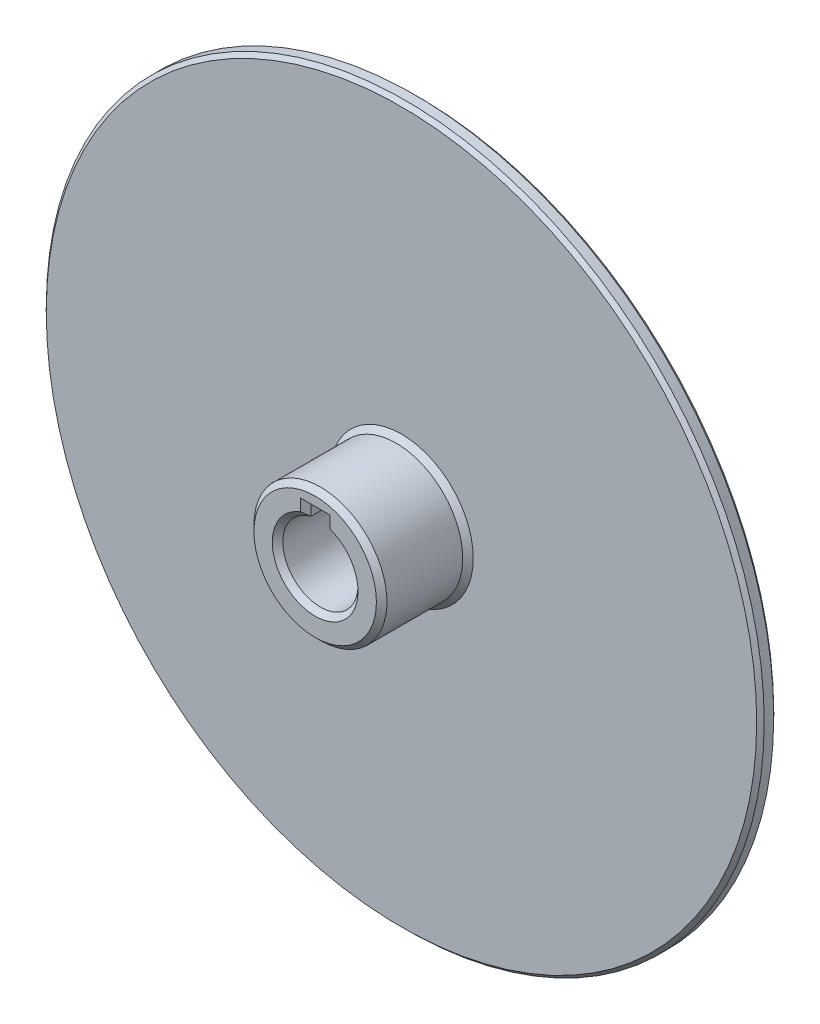
ISO-10303-21;
HEADER;
FILE_DESCRIPTION(('STEP AP214'),'2;1');
FILE_NAME('part.step','',(''),(''),'','','');
FILE_SCHEMA(('AUTOMOTIVE_DESIGN { 1 0 10303 214 1 1 1 1 }'));
ENDSEC;
DATA;
#1=APPLICATION_CONTEXT('core data for automotive mechanical design processes');
#2=APPLICATION_PROTOCOL_DEFINITION('international standard','automotive_design',2000,#1);
#3=PRODUCT_CONTEXT('',#1,'mechanical');
#4=PRODUCT('Part','Part','',(#3));
#5=PRODUCT_RELATED_PRODUCT_CATEGORY('part','',(#4));
#6=PRODUCT_DEFINITION_FORMATION('','',#4);
#7=PRODUCT_DEFINITION_CONTEXT('part definition',#1,'design');
#8=PRODUCT_DEFINITION('design','',#6,#7);
#9=PRODUCT_DEFINITION_SHAPE('','',#8);
#10=(LENGTH_UNIT() NAMED_UNIT(*) SI_UNIT(.MILLI.,.METRE.));
#11=(NAMED_UNIT(*) PLANE_ANGLE_UNIT() SI_UNIT($,.RADIAN.));
#12=(NAMED_UNIT(*) SI_UNIT($,.STERADIAN.) SOLID_ANGLE_UNIT());
#13=UNCERTAINTY_MEASURE_WITH_UNIT(LENGTH_MEASURE(1.E-05),#10,'distance_accuracy_value','');
#14=(GEOMETRIC_REPRESENTATION_CONTEXT(3) GLOBAL_UNCERTAINTY_ASSIGNED_CONTEXT((#13)) GLOBAL_UNIT_ASSIGNED_CONTEXT((#10,
#11,#12)) REPRESENTATION_CONTEXT('',''));
#15=CARTESIAN_POINT('',(0.,0.,0.));
#16=DIRECTION('',(0.,0.,1.));
#17=DIRECTION('',(1.,0.,0.));
#18=AXIS2_PLACEMENT_3D('',#15,#16,#17);
#19=CARTESIAN_POINT('',(0.,0.,5.7658));
#20=DIRECTION('',(0.,0.,-1.));
#21=DIRECTION('',(-1.,0.,0.));
#22=AXIS2_PLACEMENT_3D('',#19,#20,#21);
#23=CYLINDRICAL_SURFACE('',#22,121.3314985735);
#24=CARTESIAN_POINT('',(0.,0.,1.27000000000012));
#25=DIRECTION('',(0.,0.,1.));
#26=DIRECTION('',(1.,0.,0.));
#27=AXIS2_PLACEMENT_3D('',#24,#25,#26);
#28=CIRCLE('',#27,121.3314985735);
#29=CARTESIAN_POINT('',(-121.3314985735,0.,1.27000000000012));
#30=VERTEX_POINT('',#29);
#31=EDGE_CURVE('E349',#30,#30,#28,.T.);
#32=CARTESIAN_POINT('',(0.,0.,4.49580000000024));
#33=DIRECTION('',(0.,0.,1.));
#34=DIRECTION('',(1.,0.,0.));
#35=AXIS2_PLACEMENT_3D('',#32,#33,#34);
#36=CIRCLE('',#35,121.3314985735);
#37=CARTESIAN_POINT('',(-121.3314985735,0.,4.49580000000024));
#38=VERTEX_POINT('',#37);
#39=EDGE_CURVE('E339',#38,#38,#36,.F.);
#40=CARTESIAN_POINT('',(-121.3314985735,0.,1.27000000000012));
#41=CARTESIAN_POINT('',(-121.3314985735,0.,1.30360208333345));
#42=CARTESIAN_POINT('',(-121.3314985735,0.,1.33720416666679));
#43=CARTESIAN_POINT('',(-121.3314985735,0.,1.40440833333346));
#44=CARTESIAN_POINT('',(-121.3314985735,0.,1.43801041666679));
#45=CARTESIAN_POINT('',(-121.3314985735,0.,1.50521458333346));
#46=CARTESIAN_POINT('',(-121.3314985735,0.,1.53881666666679));
#47=CARTESIAN_POINT('',(-121.3314985735,0.,1.60602083333346));
#48=CARTESIAN_POINT('',(-121.3314985735,0.,1.6396229166668));
#49=CARTESIAN_POINT('',(-121.3314985735,0.,1.70682708333347));
#50=CARTESIAN_POINT('',(-121.3314985735,0.,1.7404291666668));
#51=CARTESIAN_POINT('',(-121.3314985735,0.,1.80763333333347));
#52=CARTESIAN_POINT('',(-121.3314985735,0.,1.84123541666681));
#53=CARTESIAN_POINT('',(-121.3314985735,0.,1.90843958333348));
#54=CARTESIAN_POINT('',(-121.3314985735,0.,1.94204166666681));
#55=CARTESIAN_POINT('',(-121.3314985735,0.,2.00924583333348));
#56=CARTESIAN_POINT('',(-121.3314985735,0.,2.04284791666681));
#57=CARTESIAN_POINT('',(-121.3314985735,0.,2.11005208333348));
#58=CARTESIAN_POINT('',(-121.3314985735,0.,2.14365416666682));
#59=CARTESIAN_POINT('',(-121.3314985735,0.,2.21085833333349));
#60=CARTESIAN_POINT('',(-121.3314985735,0.,2.24446041666682));
#61=CARTESIAN_POINT('',(-121.3314985735,0.,2.31166458333349));
#62=CARTESIAN_POINT('',(-121.3314985735,0.,2.34526666666683));
#63=CARTESIAN_POINT('',(-121.3314985735,0.,2.41247083333349));
#64=CARTESIAN_POINT('',(-121.3314985735,0.,2.44607291666683));
#65=CARTESIAN_POINT('',(-121.3314985735,0.,2.5132770833335));
#66=CARTESIAN_POINT('',(-121.3314985735,0.,2.54687916666683));
#67=CARTESIAN_POINT('',(-121.3314985735,0.,2.6140833333335));
#68=CARTESIAN_POINT('',(-121.3314985735,0.,2.64768541666684));
#69=CARTESIAN_POINT('',(-121.3314985735,0.,2.71488958333351));
#70=CARTESIAN_POINT('',(-121.3314985735,0.,2.74849166666684));
#71=CARTESIAN_POINT('',(-121.3314985735,0.,2.81569583333351));
#72=CARTESIAN_POINT('',(-121.3314985735,0.,2.84929791666684));
#73=CARTESIAN_POINT('',(-121.3314985735,0.,2.91650208333351));
#74=CARTESIAN_POINT('',(-121.3314985735,0.,2.95010416666685));
#75=CARTESIAN_POINT('',(-121.3314985735,0.,3.01730833333352));
#76=CARTESIAN_POINT('',(-121.3314985735,0.,3.05091041666685));
#77=CARTESIAN_POINT('',(-121.3314985735,0.,3.11811458333352));
#78=CARTESIAN_POINT('',(-121.3314985735,0.,3.15171666666686));
#79=CARTESIAN_POINT('',(-121.3314985735,0.,3.21892083333353));
#80=CARTESIAN_POINT('',(-121.3314985735,0.,3.25252291666686));
#81=CARTESIAN_POINT('',(-121.3314985735,0.,3.31972708333353));
#82=CARTESIAN_POINT('',(-121.3314985735,0.,3.35332916666686));
#83=CARTESIAN_POINT('',(-121.3314985735,0.,3.42053333333353));
#84=CARTESIAN_POINT('',(-121.3314985735,0.,3.45413541666687));
#85=CARTESIAN_POINT('',(-121.3314985735,0.,3.52133958333354));
#86=CARTESIAN_POINT('',(-121.3314985735,0.,3.55494166666687));
#87=CARTESIAN_POINT('',(-121.3314985735,0.,3.62214583333354));
#88=CARTESIAN_POINT('',(-121.3314985735,0.,3.65574791666688));
#89=CARTESIAN_POINT('',(-121.3314985735,0.,3.72295208333355));
#90=CARTESIAN_POINT('',(-121.3314985735,0.,3.75655416666688));
#91=CARTESIAN_POINT('',(-121.3314985735,0.,3.82375833333355));
#92=CARTESIAN_POINT('',(-121.3314985735,0.,3.85736041666688));
#93=CARTESIAN_POINT('',(-121.3314985735,0.,3.92456458333355));
#94=CARTESIAN_POINT('',(-121.3314985735,0.,3.95816666666689));
#95=CARTESIAN_POINT('',(-121.3314985735,0.,4.02537083333356));
#96=CARTESIAN_POINT('',(-121.3314985735,0.,4.05897291666689));
#97=CARTESIAN_POINT('',(-121.3314985735,0.,4.12617708333356));
#98=CARTESIAN_POINT('',(-121.3314985735,0.,4.1597791666669));
#99=CARTESIAN_POINT('',(-121.3314985735,0.,4.22698333333356));
#100=CARTESIAN_POINT('',(-121.3314985735,0.,4.2605854166669));
#101=CARTESIAN_POINT('',(-121.3314985735,0.,4.32778958333357));
#102=CARTESIAN_POINT('',(-121.3314985735,0.,4.3613916666669));
#103=CARTESIAN_POINT('',(-121.3314985735,0.,4.42859583333357));
#104=CARTESIAN_POINT('',(-121.3314985735,0.,4.46219791666691));
#105=CARTESIAN_POINT('',(-121.3314985735,0.,4.49580000000024));
#106=B_SPLINE_CURVE_WITH_KNOTS('',3,(#40,#41,#42,#43,#44,#45,#46,#47,#48,#49,#50,#51,#52,#53,
#54,#55,#56,#57,#58,#59,#60,#61,#62,#63,#64,#65,#66,#67,#68,#69,#70,#71,#72,#73,#74,#75,#76,#77,
#78,#79,#80,#81,#82,#83,#84,#85,#86,#87,#88,#89,#90,#91,#92,#93,#94,#95,#96,#97,#98,#99,#100,
#101,#102,#103,#104,#105),.UNSPECIFIED.,.F.,.F.,(4,2,2,2,2,2,2,2,2,2,2,2,2,2,2,2,2,2,2,2,2,2,2,
2,2,2,2,2,2,2,2,2,4),(0.,0.100806250000003,0.201612500000008,0.302418750000011,
0.403225000000016,0.504031250000019,0.604837500000023,0.705643750000027,0.806450000000031,
0.907256250000035,1.00806250000004,1.10886875000004,1.20967500000005,1.31048125000005,
1.41128750000005,1.51209375000006,1.61290000000006,1.71370625000007,1.81451250000007,
1.91531875000007,2.01612500000008,2.11693125000008,2.21773750000009,2.31854375000009,
2.41935000000009,2.5201562500001,2.6209625000001,2.7217687500001,2.82257500000011,
2.92338125000011,3.02418750000012,3.12499375000012,3.22580000000012),.UNSPECIFIED.);
#107=EDGE_CURVE('BSEAM49',#30,#38,#106,.T.);
#108=ORIENTED_EDGE('',*,*,#31,.T.);
#109=ORIENTED_EDGE('',*,*,#39,.T.);
#110=ORIENTED_EDGE('',*,*,#107,.T.);
#111=ORIENTED_EDGE('',*,*,#107,.F.);
#112=EDGE_LOOP('',(#108,#110,#109,#111));
#113=FACE_BOUND('',#112,.T.);
#114=ADVANCED_FACE('F49',(#113),#23,.T.);
#115=CARTESIAN_POINT('',(0.,0.,5.7658));
#116=DIRECTION('',(0.,0.,1.));
#117=DIRECTION('',(1.,0.,0.));
#118=AXIS2_PLACEMENT_3D('',#115,#116,#117);
#119=PLANE('',#118);
#120=CARTESIAN_POINT('',(0.,0.,5.7658));
#121=DIRECTION('',(0.,0.,1.));
#122=DIRECTION('',(1.,0.,0.));
#123=AXIS2_PLACEMENT_3D('',#120,#121,#122);
#124=CIRCLE('',#123,24.2570000000002);
#125=CARTESIAN_POINT('',(24.2570000000002,0.,5.7658));
#126=VERTEX_POINT('',#125);
#127=EDGE_CURVE('E11',#126,#126,#124,.F.);
#128=ORIENTED_EDGE('',*,*,#127,.T.);
#129=EDGE_LOOP('',(#128));
#130=FACE_BOUND('',#129,.T.);
#131=CARTESIAN_POINT('',(0.,0.,5.7658));
#132=DIRECTION('',(0.,0.,1.));
#133=DIRECTION('',(1.,0.,0.));
#134=AXIS2_PLACEMENT_3D('',#131,#132,#133);
#135=CIRCLE('',#134,120.0614985735);
#136=CARTESIAN_POINT('',(120.0614985735,0.,5.7658));
#137=VERTEX_POINT('',#136);
#138=EDGE_CURVE('E162',#137,#137,#135,.T.);
#139=ORIENTED_EDGE('',*,*,#138,.T.);
#140=EDGE_LOOP('',(#139));
#141=FACE_BOUND('',#140,.T.);
#142=ADVANCED_FACE('F311',(#130,#141),#119,.T.);
#143=CARTESIAN_POINT('',(0.,0.,0.));
#144=DIRECTION('',(0.,0.,1.));
#145=DIRECTION('',(1.,0.,0.));
#146=AXIS2_PLACEMENT_3D('',#143,#144,#145);
#147=PLANE('',#146);
#148=CARTESIAN_POINT('',(0.,0.,0.));
#149=DIRECTION('',(0.,0.,1.));
#150=DIRECTION('',(1.,0.,0.));
#151=AXIS2_PLACEMENT_3D('',#148,#149,#150);
#152=CIRCLE('',#151,14.478);
#153=CARTESIAN_POINT('',(-4.953,13.6044211563741,0.));
#154=VERTEX_POINT('',#153);
#155=CARTESIAN_POINT('',(4.953,13.6044211563741,0.));
#156=VERTEX_POINT('',#155);
#157=EDGE_CURVE('E167',#154,#156,#152,.T.);
#158=ORIENTED_EDGE('',*,*,#157,.T.);
#159=DIRECTION('',(0.,1.,0.));
#160=VECTOR('',#159,1.);
#161=CARTESIAN_POINT('',(4.953,0.,0.));
#162=LINE('',#161,#160);
#163=CARTESIAN_POINT('',(4.953,17.653,0.));
#164=VERTEX_POINT('',#163);
#165=EDGE_CURVE('E145',#156,#164,#162,.T.);
#166=ORIENTED_EDGE('',*,*,#165,.T.);
#167=DIRECTION('',(-1.,0.,0.));
#168=VECTOR('',#167,1.);
#169=CARTESIAN_POINT('',(0.,17.653,0.));
#170=LINE('',#169,#168);
#171=CARTESIAN_POINT('',(-4.953,17.653,0.));
#172=VERTEX_POINT('',#171);
#173=EDGE_CURVE('E154',#164,#172,#170,.T.);
#174=ORIENTED_EDGE('',*,*,#173,.T.);
#175=DIRECTION('',(0.,-1.,0.));
#176=VECTOR('',#175,1.);
#177=CARTESIAN_POINT('',(-4.953,0.,0.));
#178=LINE('',#177,#176);
#179=EDGE_CURVE('E161',#172,#154,#178,.T.);
#180=ORIENTED_EDGE('',*,*,#179,.T.);
#181=EDGE_LOOP('',(#158,#166,#174,#180));
#182=FACE_BOUND('',#181,.T.);
#183=CARTESIAN_POINT('',(0.,0.,0.));
#184=DIRECTION('',(0.,0.,1.));
#185=DIRECTION('',(1.,0.,0.));
#186=AXIS2_PLACEMENT_3D('',#183,#184,#185);
#187=CIRCLE('',#186,120.0614985735);
#188=CARTESIAN_POINT('',(120.0614985735,0.,0.));
#189=VERTEX_POINT('',#188);
#190=EDGE_CURVE('E344',#189,#189,#187,.F.);
#191=ORIENTED_EDGE('',*,*,#190,.T.);
#192=EDGE_LOOP('',(#191));
#193=FACE_BOUND('',#192,.T.);
#194=ADVANCED_FACE('F164',(#182,#193),#147,.F.);
#195=CARTESIAN_POINT('',(0.,0.,34.940748));
#196=DIRECTION('',(0.,0.,-1.));
#197=DIRECTION('',(-1.,0.,0.));
#198=AXIS2_PLACEMENT_3D('',#195,#196,#197);
#199=CYLINDRICAL_SURFACE('',#198,22.479);
#200=CARTESIAN_POINT('',(0.,0.,7.54380000000021));
#201=DIRECTION('',(0.,0.,1.));
#202=DIRECTION('',(1.,0.,0.));
#203=AXIS2_PLACEMENT_3D('',#200,#201,#202);
#204=CIRCLE('',#203,22.479);
#205=CARTESIAN_POINT('',(-22.479,0.,7.54380000000021));
#206=VERTEX_POINT('',#205);
#207=EDGE_CURVE('E66',#206,#206,#204,.T.);
#208=CARTESIAN_POINT('',(0.,0.,33.1627480000002));
#209=DIRECTION('',(0.,0.,1.));
#210=DIRECTION('',(1.,0.,0.));
#211=AXIS2_PLACEMENT_3D('',#208,#209,#210);
#212=CIRCLE('',#211,22.479);
#213=CARTESIAN_POINT('',(-22.479,0.,33.1627480000002));
#214=VERTEX_POINT('',#213);
#215=EDGE_CURVE('E214',#214,#214,#212,.F.);
#216=CARTESIAN_POINT('',(-22.479,0.,7.54380000000021));
#217=CARTESIAN_POINT('',(-22.479,0.,7.81066404166687));
#218=CARTESIAN_POINT('',(-22.479,0.,8.07752808333354));
#219=CARTESIAN_POINT('',(-22.479,0.,8.61125616666687));
#220=CARTESIAN_POINT('',(-22.479,0.,8.87812020833354));
#221=CARTESIAN_POINT('',(-22.479,0.,9.41184829166687));
#222=CARTESIAN_POINT('',(-22.479,0.,9.67871233333354));
#223=CARTESIAN_POINT('',(-22.479,0.,10.2124404166669));
#224=CARTESIAN_POINT('',(-22.479,0.,10.4793044583335));
#225=CARTESIAN_POINT('',(-22.479,0.,11.0130325416669));
#226=CARTESIAN_POINT('',(-22.479,0.,11.2798965833335));
#227=CARTESIAN_POINT('',(-22.479,0.,11.8136246666669));
#228=CARTESIAN_POINT('',(-22.479,0.,12.0804887083335));
#229=CARTESIAN_POINT('',(-22.479,0.,12.6142167916669));
#230=CARTESIAN_POINT('',(-22.479,0.,12.8810808333335));
#231=CARTESIAN_POINT('',(-22.479,0.,13.4148089166669));
#232=CARTESIAN_POINT('',(-22.479,0.,13.6816729583335));
#233=CARTESIAN_POINT('',(-22.479,0.,14.2154010416669));
#234=CARTESIAN_POINT('',(-22.479,0.,14.4822650833335));
#235=CARTESIAN_POINT('',(-22.479,0.,15.0159931666669));
#236=CARTESIAN_POINT('',(-22.479,0.,15.2828572083335));
#237=CARTESIAN_POINT('',(-22.479,0.,15.8165852916669));
#238=CARTESIAN_POINT('',(-22.479,0.,16.0834493333335));
#239=CARTESIAN_POINT('',(-22.479,0.,16.6171774166669));
#240=CARTESIAN_POINT('',(-22.479,0.,16.8840414583335));
#241=CARTESIAN_POINT('',(-22.479,0.,17.4177695416669));
#242=CARTESIAN_POINT('',(-22.479,0.,17.6846335833335));
#243=CARTESIAN_POINT('',(-22.479,0.,18.2183616666669));
#244=CARTESIAN_POINT('',(-22.479,0.,18.4852257083335));
#245=CARTESIAN_POINT('',(-22.479,0.,19.0189537916669));
#246=CARTESIAN_POINT('',(-22.479,0.,19.2858178333335));
#247=CARTESIAN_POINT('',(-22.479,0.,19.8195459166669));
#248=CARTESIAN_POINT('',(-22.479,0.,20.0864099583335));
#249=CARTESIAN_POINT('',(-22.479,0.,20.6201380416669));
#250=CARTESIAN_POINT('',(-22.479,0.,20.8870020833335));
#251=CARTESIAN_POINT('',(-22.479,0.,21.4207301666669));
#252=CARTESIAN_POINT('',(-22.479,0.,21.6875942083335));
#253=CARTESIAN_POINT('',(-22.479,0.,22.2213222916669));
#254=CARTESIAN_POINT('',(-22.479,0.,22.4881863333335));
#255=CARTESIAN_POINT('',(-22.479,0.,23.0219144166669));
#256=CARTESIAN_POINT('',(-22.479,0.,23.2887784583335));
#257=CARTESIAN_POINT('',(-22.479,0.,23.8225065416669));
#258=CARTESIAN_POINT('',(-22.479,0.,24.0893705833335));
#259=CARTESIAN_POINT('',(-22.479,0.,24.6230986666669));
#260=CARTESIAN_POINT('',(-22.479,0.,24.8899627083335));
#261=CARTESIAN_POINT('',(-22.479,0.,25.4236907916669));
#262=CARTESIAN_POINT('',(-22.479,0.,25.6905548333335));
#263=CARTESIAN_POINT('',(-22.479,0.,26.2242829166669));
#264=CARTESIAN_POINT('',(-22.479,0.,26.4911469583335));
#265=CARTESIAN_POINT('',(-22.479,0.,27.0248750416668));
#266=CARTESIAN_POINT('',(-22.479,0.,27.2917390833335));
#267=CARTESIAN_POINT('',(-22.479,0.,27.8254671666668));
#268=CARTESIAN_POINT('',(-22.479,0.,28.0923312083335));
#269=CARTESIAN_POINT('',(-22.479,0.,28.6260592916668));
#270=CARTESIAN_POINT('',(-22.479,0.,28.8929233333335));
#271=CARTESIAN_POINT('',(-22.479,0.,29.4266514166668));
#272=CARTESIAN_POINT('',(-22.479,0.,29.6935154583335));
#273=CARTESIAN_POINT('',(-22.479,0.,30.2272435416668));
#274=CARTESIAN_POINT('',(-22.479,0.,30.4941075833335));
#275=CARTESIAN_POINT('',(-22.479,0.,31.0278356666668));
#276=CARTESIAN_POINT('',(-22.479,0.,31.2946997083335));
#277=CARTESIAN_POINT('',(-22.479,0.,31.8284277916669));
#278=CARTESIAN_POINT('',(-22.479,0.,32.0952918333335));
#279=CARTESIAN_POINT('',(-22.479,0.,32.6290199166668));
#280=CARTESIAN_POINT('',(-22.479,0.,32.8958839583335));
#281=CARTESIAN_POINT('',(-22.479,0.,33.1627480000002));
#282=B_SPLINE_CURVE_WITH_KNOTS('',3,(#216,#217,#218,#219,#220,#221,#222,#223,#224,#225,#226,
#227,#228,#229,#230,#231,#232,#233,#234,#235,#236,#237,#238,#239,#240,#241,#242,#243,#244,#245,
#246,#247,#248,#249,#250,#251,#252,#253,#254,#255,#256,#257,#258,#259,#260,#261,#262,#263,#264,
#265,#266,#267,#268,#269,#270,#271,#272,#273,#274,#275,#276,#277,#278,#279,#280,#281),
.UNSPECIFIED.,.F.,.F.,(4,2,2,2,2,2,2,2,2,2,2,2,2,2,2,2,2,2,2,2,2,2,2,2,2,2,2,2,2,2,2,2,4),(0.,
0.800592124999999,1.60118425,2.401776375,3.2023685,4.002960625,4.80355275,5.60414487499999,
6.40473699999999,7.20532912499999,8.00592124999999,8.80651337499999,9.60710549999999,
10.407697625,11.20828975,12.008881875,12.809474,13.610066125,14.41065825,15.211250375,
16.0118425,16.812434625,17.61302675,18.413618875,19.214211,20.014803125,20.81539525,
21.615987375,22.4165795,23.217171625,24.01776375,24.818355875,25.618948),.UNSPECIFIED.);
#283=EDGE_CURVE('BSEAM413',#206,#214,#282,.T.);
#284=ORIENTED_EDGE('',*,*,#207,.T.);
#285=ORIENTED_EDGE('',*,*,#215,.T.);
#286=ORIENTED_EDGE('',*,*,#283,.T.);
#287=ORIENTED_EDGE('',*,*,#283,.F.);
#288=EDGE_LOOP('',(#284,#286,#285,#287));
#289=FACE_BOUND('',#288,.T.);
#290=ADVANCED_FACE('F413',(#289),#199,.T.);
#291=CARTESIAN_POINT('',(0.,0.,34.940748));
#292=DIRECTION('',(0.,0.,1.));
#293=DIRECTION('',(1.,0.,0.));
#294=AXIS2_PLACEMENT_3D('',#291,#292,#293);
#295=PLANE('',#294);
#296=DIRECTION('',(1.,0.,0.));
#297=VECTOR('',#296,1.);
#298=CARTESIAN_POINT('',(3.175,17.6530000000001,34.940748));
#299=LINE('',#298,#297);
#300=CARTESIAN_POINT('',(-4.9530000000001,17.6530000000001,34.940748));
#301=VERTEX_POINT('',#300);
#302=CARTESIAN_POINT('',(4.9530000000001,17.6530000000001,34.940748));
#303=VERTEX_POINT('',#302);
#304=EDGE_CURVE('E77',#301,#303,#299,.T.);
#305=ORIENTED_EDGE('',*,*,#304,.T.);
#306=DIRECTION('',(0.,-1.,0.));
#307=VECTOR('',#306,1.);
#308=CARTESIAN_POINT('',(4.9530000000001,12.2967221242085,34.940748));
#309=LINE('',#308,#307);
#310=CARTESIAN_POINT('',(4.9530000000001,13.6044211563742,34.940748));
#311=VERTEX_POINT('',#310);
#312=EDGE_CURVE('E211',#303,#311,#309,.T.);
#313=ORIENTED_EDGE('',*,*,#312,.T.);
#314=CARTESIAN_POINT('',(0.,0.,34.940748));
#315=DIRECTION('',(0.,0.,1.));
#316=DIRECTION('',(1.,0.,0.));
#317=AXIS2_PLACEMENT_3D('',#314,#315,#316);
#318=CIRCLE('',#317,14.4780000000001);
#319=CARTESIAN_POINT('',(-4.9530000000001,13.6044211563742,34.940748));
#320=VERTEX_POINT('',#319);
#321=EDGE_CURVE('E204',#311,#320,#318,.F.);
#322=ORIENTED_EDGE('',*,*,#321,.T.);
#323=DIRECTION('',(0.,1.,0.));
#324=VECTOR('',#323,1.);
#325=CARTESIAN_POINT('',(-4.9530000000001,15.875,34.940748));
#326=LINE('',#325,#324);
#327=EDGE_CURVE('E85',#320,#301,#326,.T.);
#328=ORIENTED_EDGE('',*,*,#327,.T.);
#329=EDGE_LOOP('',(#305,#313,#322,#328));
#330=FACE_BOUND('',#329,.T.);
#331=CARTESIAN_POINT('',(0.,0.,34.940748));
#332=DIRECTION('',(0.,0.,1.));
#333=DIRECTION('',(1.,0.,0.));
#334=AXIS2_PLACEMENT_3D('',#331,#332,#333);
#335=CIRCLE('',#334,20.7010000000002);
#336=CARTESIAN_POINT('',(20.7010000000002,0.,34.940748));
#337=VERTEX_POINT('',#336);
#338=EDGE_CURVE('E200',#337,#337,#335,.T.);
#339=ORIENTED_EDGE('',*,*,#338,.T.);
#340=EDGE_LOOP('',(#339));
#341=FACE_BOUND('',#340,.T.);
#342=ADVANCED_FACE('F410',(#330,#341),#295,.T.);
#343=CARTESIAN_POINT('',(0.,0.,0.));
#344=DIRECTION('',(0.,0.,1.));
#345=DIRECTION('',(1.,0.,0.));
#346=AXIS2_PLACEMENT_3D('',#343,#344,#345);
#347=CYLINDRICAL_SURFACE('',#346,12.7);
#348=DIRECTION('',(0.,0.,1.));
#349=VECTOR('',#348,1.);
#350=CARTESIAN_POINT('',(3.175,12.2967221242085,0.));
#351=LINE('',#350,#349);
#352=CARTESIAN_POINT('',(3.175,12.2967221242085,33.1627479999999));
#353=VERTEX_POINT('',#352);
#354=CARTESIAN_POINT('',(3.175,12.2967221242085,1.778));
#355=VERTEX_POINT('',#354);
#356=EDGE_CURVE('E365',#353,#355,#351,.F.);
#357=ORIENTED_EDGE('',*,*,#356,.T.);
#358=CARTESIAN_POINT('',(0.,0.,1.778));
#359=DIRECTION('',(0.,0.,1.));
#360=DIRECTION('',(1.,0.,0.));
#361=AXIS2_PLACEMENT_3D('',#358,#359,#360);
#362=CIRCLE('',#361,12.7);
#363=CARTESIAN_POINT('',(-3.175,12.2967221242086,1.778));
#364=VERTEX_POINT('',#363);
#365=EDGE_CURVE('E185',#355,#364,#362,.F.);
#366=ORIENTED_EDGE('',*,*,#365,.T.);
#367=DIRECTION('',(0.,0.,1.));
#368=VECTOR('',#367,1.);
#369=CARTESIAN_POINT('',(-3.175,12.2967221242086,0.));
#370=LINE('',#369,#368);
#371=CARTESIAN_POINT('',(-3.175,12.2967221242086,33.1627479999999));
#372=VERTEX_POINT('',#371);
#373=EDGE_CURVE('E370',#364,#372,#370,.T.);
#374=ORIENTED_EDGE('',*,*,#373,.T.);
#375=CARTESIAN_POINT('',(0.,0.,33.1627479999999));
#376=DIRECTION('',(0.,0.,1.));
#377=DIRECTION('',(1.,0.,0.));
#378=AXIS2_PLACEMENT_3D('',#375,#376,#377);
#379=CIRCLE('',#378,12.7);
#380=EDGE_CURVE('E182',#372,#353,#379,.T.);
#381=ORIENTED_EDGE('',*,*,#380,.T.);
#382=EDGE_LOOP('',(#357,#366,#374,#381));
#383=FACE_BOUND('',#382,.T.);
#384=ADVANCED_FACE('F368',(#383),#347,.F.);
#385=CARTESIAN_POINT('',(3.175,15.875,0.));
#386=DIRECTION('',(1.,0.,0.));
#387=DIRECTION('',(0.,1.,0.));
#388=AXIS2_PLACEMENT_3D('',#385,#386,#387);
#389=PLANE('',#388);
#390=DIRECTION('',(0.,0.,1.));
#391=VECTOR('',#390,1.);
#392=CARTESIAN_POINT('',(3.175,15.875,0.));
#393=LINE('',#392,#391);
#394=CARTESIAN_POINT('',(3.175,15.875,1.778));
#395=VERTEX_POINT('',#394);
#396=CARTESIAN_POINT('',(3.175,15.875,33.1627479999999));
#397=VERTEX_POINT('',#396);
#398=EDGE_CURVE('E267',#395,#397,#393,.T.);
#399=ORIENTED_EDGE('',*,*,#398,.F.);
#400=DIRECTION('',(0.,-1.,0.));
#401=VECTOR('',#400,1.);
#402=CARTESIAN_POINT('',(3.175,15.875,1.778));
#403=LINE('',#402,#401);
#404=EDGE_CURVE('E147',#395,#355,#403,.T.);
#405=ORIENTED_EDGE('',*,*,#404,.T.);
#406=ORIENTED_EDGE('',*,*,#356,.F.);
#407=DIRECTION('',(0.,1.,0.));
#408=VECTOR('',#407,1.);
#409=CARTESIAN_POINT('',(3.175,15.875,33.1627479999999));
#410=LINE('',#409,#408);
#411=EDGE_CURVE('E170',#353,#397,#410,.T.);
#412=ORIENTED_EDGE('',*,*,#411,.T.);
#413=EDGE_LOOP('',(#399,#405,#406,#412));
#414=FACE_BOUND('',#413,.T.);
#415=ADVANCED_FACE('F364',(#414),#389,.F.);
#416=CARTESIAN_POINT('',(-3.175,15.875,0.));
#417=DIRECTION('',(-1.,0.,0.));
#418=DIRECTION('',(0.,-1.,0.));
#419=AXIS2_PLACEMENT_3D('',#416,#417,#418);
#420=PLANE('',#419);
#421=ORIENTED_EDGE('',*,*,#373,.F.);
#422=DIRECTION('',(0.,1.,0.));
#423=VECTOR('',#422,1.);
#424=CARTESIAN_POINT('',(-3.175,15.875,1.778));
#425=LINE('',#424,#423);
#426=CARTESIAN_POINT('',(-3.175,15.875,1.778));
#427=VERTEX_POINT('',#426);
#428=EDGE_CURVE('E191',#364,#427,#425,.T.);
#429=ORIENTED_EDGE('',*,*,#428,.T.);
#430=DIRECTION('',(0.,0.,1.));
#431=VECTOR('',#430,1.);
#432=CARTESIAN_POINT('',(-3.175,15.875,0.));
#433=LINE('',#432,#431);
#434=CARTESIAN_POINT('',(-3.175,15.875,33.1627479999999));
#435=VERTEX_POINT('',#434);
#436=EDGE_CURVE('E374',#427,#435,#433,.T.);
#437=ORIENTED_EDGE('',*,*,#436,.T.);
#438=DIRECTION('',(0.,-1.,0.));
#439=VECTOR('',#438,1.);
#440=CARTESIAN_POINT('',(-3.175,12.2967221242086,33.1627479999999));
#441=LINE('',#440,#439);
#442=EDGE_CURVE('E188',#435,#372,#441,.T.);
#443=ORIENTED_EDGE('',*,*,#442,.T.);
#444=EDGE_LOOP('',(#421,#429,#437,#443));
#445=FACE_BOUND('',#444,.T.);
#446=ADVANCED_FACE('F387',(#445),#420,.F.);
#447=CARTESIAN_POINT('',(-3.175,15.875,0.));
#448=DIRECTION('',(0.,1.,0.));
#449=DIRECTION('',(0.,0.,1.));
#450=AXIS2_PLACEMENT_3D('',#447,#448,#449);
#451=PLANE('',#450);
#452=ORIENTED_EDGE('',*,*,#436,.F.);
#453=DIRECTION('',(1.,0.,0.));
#454=VECTOR('',#453,1.);
#455=CARTESIAN_POINT('',(-3.175,15.875,1.778));
#456=LINE('',#455,#454);
#457=EDGE_CURVE('E197',#427,#395,#456,.T.);
#458=ORIENTED_EDGE('',*,*,#457,.T.);
#459=ORIENTED_EDGE('',*,*,#398,.T.);
#460=DIRECTION('',(-1.,0.,0.));
#461=VECTOR('',#460,1.);
#462=CARTESIAN_POINT('',(-3.175,15.875,33.1627479999999));
#463=LINE('',#462,#461);
#464=EDGE_CURVE('E194',#397,#435,#463,.T.);
#465=ORIENTED_EDGE('',*,*,#464,.T.);
#466=EDGE_LOOP('',(#452,#458,#459,#465));
#467=FACE_BOUND('',#466,.T.);
#468=ADVANCED_FACE('F328',(#467),#451,.F.);
#469=CARTESIAN_POINT('',(0.,0.,1.27000000000012));
#470=DIRECTION('',(0.,0.,1.));
#471=DIRECTION('',(1.,0.,0.));
#472=AXIS2_PLACEMENT_3D('',#469,#470,#471);
#473=CONICAL_SURFACE('',#472,121.3314985735,0.785398163397454);
#474=ORIENTED_EDGE('',*,*,#190,.F.);
#475=EDGE_LOOP('',(#474));
#476=FACE_BOUND('',#475,.T.);
#477=ORIENTED_EDGE('',*,*,#31,.F.);
#478=EDGE_LOOP('',(#477));
#479=FACE_BOUND('',#478,.T.);
#480=ADVANCED_FACE('F325',(#476,#479),#473,.T.);
#481=CARTESIAN_POINT('',(0.,0.,5.7658));
#482=DIRECTION('',(0.,0.,-1.));
#483=DIRECTION('',(-1.,0.,0.));
#484=AXIS2_PLACEMENT_3D('',#481,#482,#483);
#485=CONICAL_SURFACE('',#484,120.0614985735,0.785398163397465);
#486=ORIENTED_EDGE('',*,*,#39,.F.);
#487=EDGE_LOOP('',(#486));
#488=FACE_BOUND('',#487,.T.);
#489=ORIENTED_EDGE('',*,*,#138,.F.);
#490=EDGE_LOOP('',(#489));
#491=FACE_BOUND('',#490,.T.);
#492=ADVANCED_FACE('F253',(#488,#491),#485,.T.);
#493=CARTESIAN_POINT('',(-4.953,0.,0.));
#494=DIRECTION('',(-0.707106781186547,0.,0.707106781186547));
#495=DIRECTION('',(0.,-1.,0.));
#496=AXIS2_PLACEMENT_3D('',#493,#494,#495);
#497=PLANE('',#496);
#498=DIRECTION('',(-0.577350269189626,0.577350269189626,-0.577350269189626));
#499=VECTOR('',#498,1.);
#500=CARTESIAN_POINT('',(0.931333333333333,11.7686666666667,5.88433333333333));
#501=LINE('',#500,#499);
#502=EDGE_CURVE('E157',#427,#172,#501,.T.);
#503=ORIENTED_EDGE('',*,*,#502,.F.);
#504=ORIENTED_EDGE('',*,*,#428,.F.);
#505=CARTESIAN_POINT('',(-3.175,12.2967221242086,1.778));
#506=CARTESIAN_POINT('',(-3.32149538455012,12.4101940069984,1.63150461544988));
#507=CARTESIAN_POINT('',(-3.46845579215077,12.5224613493286,1.48454420784923));
#508=CARTESIAN_POINT('',(-3.76322224338771,12.7446998132059,1.18977775661229));
#509=CARTESIAN_POINT('',(-3.91102819507323,12.8546711786066,1.04197180492677));
#510=CARTESIAN_POINT('',(-4.20743009001342,13.0724528551513,0.745569909986584));
#511=CARTESIAN_POINT('',(-4.35602601967459,13.1802632033294,0.596973980325414));
#512=CARTESIAN_POINT('',(-4.653968426483,13.3938461600813,0.299031573517005));
#513=CARTESIAN_POINT('',(-4.80331498205428,13.4996185499081,0.149685017945717));
#514=CARTESIAN_POINT('',(-4.953,13.6044211563741,0.));
#515=B_SPLINE_CURVE_WITH_KNOTS('',3,(#505,#506,#507,#508,#509,#510,#511,#512,#513,#514),
.UNSPECIFIED.,.F.,.F.,(4,2,2,2,4),(0.,0.708639237281418,1.41720282374273,2.12575425684842,
2.83438132430985),.UNSPECIFIED.);
#516=EDGE_CURVE('E259',#154,#364,#515,.F.);
#517=ORIENTED_EDGE('',*,*,#516,.F.);
#518=ORIENTED_EDGE('',*,*,#179,.F.);
#519=EDGE_LOOP('',(#503,#504,#517,#518));
#520=FACE_BOUND('',#519,.T.);
#521=ADVANCED_FACE('F247',(#520),#497,.F.);
#522=CARTESIAN_POINT('',(0.,0.,0.));
#523=DIRECTION('',(0.,0.,-1.));
#524=DIRECTION('',(-1.,0.,0.));
#525=AXIS2_PLACEMENT_3D('',#522,#523,#524);
#526=CONICAL_SURFACE('',#525,14.478,0.785398163397448);
#527=ORIENTED_EDGE('',*,*,#516,.T.);
#528=ORIENTED_EDGE('',*,*,#365,.F.);
#529=CARTESIAN_POINT('',(3.175,12.2967221242085,1.778));
#530=CARTESIAN_POINT('',(3.32149538455012,12.4101940069984,1.63150461544988));
#531=CARTESIAN_POINT('',(3.46845579215077,12.5224613493286,1.48454420784923));
#532=CARTESIAN_POINT('',(3.76322224338771,12.7446998132059,1.18977775661229));
#533=CARTESIAN_POINT('',(3.91102819507323,12.8546711786066,1.04197180492677));
#534=CARTESIAN_POINT('',(4.20743009001342,13.0724528551513,0.745569909986584));
#535=CARTESIAN_POINT('',(4.35602601967459,13.1802632033294,0.596973980325414));
#536=CARTESIAN_POINT('',(4.653968426483,13.3938461600813,0.299031573517005));
#537=CARTESIAN_POINT('',(4.80331498205428,13.4996185499081,0.149685017945718));
#538=CARTESIAN_POINT('',(4.953,13.6044211563741,0.));
#539=B_SPLINE_CURVE_WITH_KNOTS('',3,(#529,#530,#531,#532,#533,#534,#535,#536,#537,#538),
.UNSPECIFIED.,.F.,.F.,(4,2,2,2,4),(0.,0.708639237281419,1.41720282374273,2.12575425684842,
2.83438132430985),.UNSPECIFIED.);
#540=EDGE_CURVE('E151',#156,#355,#539,.F.);
#541=ORIENTED_EDGE('',*,*,#540,.F.);
#542=ORIENTED_EDGE('',*,*,#157,.F.);
#543=EDGE_LOOP('',(#527,#528,#541,#542));
#544=FACE_BOUND('',#543,.T.);
#545=ADVANCED_FACE('F231',(#544),#526,.F.);
#546=CARTESIAN_POINT('',(0.,17.653,0.));
#547=DIRECTION('',(0.,0.707106781186547,0.707106781186547));
#548=DIRECTION('',(-1.,0.,0.));
#549=AXIS2_PLACEMENT_3D('',#546,#547,#548);
#550=PLANE('',#549);
#551=ORIENTED_EDGE('',*,*,#502,.T.);
#552=ORIENTED_EDGE('',*,*,#173,.F.);
#553=DIRECTION('',(-0.577350269189626,-0.577350269189626,0.577350269189626));
#554=VECTOR('',#553,1.);
#555=CARTESIAN_POINT('',(-0.931333333333331,11.7686666666667,5.88433333333333));
#556=LINE('',#555,#554);
#557=EDGE_CURVE('E141',#395,#164,#556,.F.);
#558=ORIENTED_EDGE('',*,*,#557,.F.);
#559=ORIENTED_EDGE('',*,*,#457,.F.);
#560=EDGE_LOOP('',(#551,#552,#558,#559));
#561=FACE_BOUND('',#560,.T.);
#562=ADVANCED_FACE('F155',(#561),#550,.F.);
#563=CARTESIAN_POINT('',(4.953,0.,0.));
#564=DIRECTION('',(0.707106781186547,0.,0.707106781186547));
#565=DIRECTION('',(0.,1.,0.));
#566=AXIS2_PLACEMENT_3D('',#563,#564,#565);
#567=PLANE('',#566);
#568=ORIENTED_EDGE('',*,*,#540,.T.);
#569=ORIENTED_EDGE('',*,*,#404,.F.);
#570=ORIENTED_EDGE('',*,*,#557,.T.);
#571=ORIENTED_EDGE('',*,*,#165,.F.);
#572=EDGE_LOOP('',(#568,#569,#570,#571));
#573=FACE_BOUND('',#572,.T.);
#574=ADVANCED_FACE('F143',(#573),#567,.F.);
#575=CARTESIAN_POINT('',(-3.175,15.875,33.1627479999999));
#576=DIRECTION('',(0.707106781186552,0.,0.707106781186543));
#577=DIRECTION('',(0.,1.,0.));
#578=AXIS2_PLACEMENT_3D('',#575,#576,#577);
#579=PLANE('',#578);
#580=DIRECTION('',(-0.577350269189623,0.577350269189623,0.577350269189631));
#581=VECTOR('',#580,1.);
#582=CARTESIAN_POINT('',(-3.175,15.875,33.1627479999999));
#583=LINE('',#582,#581);
#584=EDGE_CURVE('E277',#301,#435,#583,.F.);
#585=ORIENTED_EDGE('',*,*,#584,.F.);
#586=ORIENTED_EDGE('',*,*,#327,.F.);
#587=CARTESIAN_POINT('',(-3.175,12.2967221242086,33.1627479999999));
#588=CARTESIAN_POINT('',(-3.32149538455013,12.4101940069984,33.30924338455));
#589=CARTESIAN_POINT('',(-3.46845579215079,12.5224613493286,33.4562037921507));
#590=CARTESIAN_POINT('',(-3.76322224338774,12.7446998132059,33.7509702433876));
#591=CARTESIAN_POINT('',(-3.91102819507327,12.8546711786067,33.8987761950732));
#592=CARTESIAN_POINT('',(-4.20743009001347,13.0724528551513,34.1951780900134));
#593=CARTESIAN_POINT('',(-4.35602601967465,13.1802632033294,34.3437740196745));
#594=CARTESIAN_POINT('',(-4.65396842648308,13.3938461600814,34.641716426483));
#595=CARTESIAN_POINT('',(-4.80331498205438,13.4996185499082,34.7910629820543));
#596=CARTESIAN_POINT('',(-4.9530000000001,13.6044211563742,34.940748));
#597=B_SPLINE_CURVE_WITH_KNOTS('',3,(#587,#588,#589,#590,#591,#592,#593,#594,#595,#596),
.UNSPECIFIED.,.F.,.F.,(4,2,2,2,4),(0.,0.708639237281462,1.41720282374281,2.12575425684855,
2.83438132431003),.UNSPECIFIED.);
#598=EDGE_CURVE('E54',#372,#320,#597,.T.);
#599=ORIENTED_EDGE('',*,*,#598,.F.);
#600=ORIENTED_EDGE('',*,*,#442,.F.);
#601=EDGE_LOOP('',(#585,#586,#599,#600));
#602=FACE_BOUND('',#601,.T.);
#603=ADVANCED_FACE('F241',(#602),#579,.T.);
#604=CARTESIAN_POINT('',(0.,0.,33.1627479999999));
#605=DIRECTION('',(0.,0.,1.));
#606=DIRECTION('',(1.,0.,0.));
#607=AXIS2_PLACEMENT_3D('',#604,#605,#606);
#608=CONICAL_SURFACE('',#607,12.7,0.785398163397442);
#609=ORIENTED_EDGE('',*,*,#598,.T.);
#610=ORIENTED_EDGE('',*,*,#321,.F.);
#611=CARTESIAN_POINT('',(4.9530000000001,13.6044211563742,34.940748));
#612=CARTESIAN_POINT('',(4.80331498205438,13.4996185499082,34.7910629820543));
#613=CARTESIAN_POINT('',(4.65396842648308,13.3938461600814,34.641716426483));
#614=CARTESIAN_POINT('',(4.35602601967466,13.1802632033294,34.3437740196745));
#615=CARTESIAN_POINT('',(4.20743009001348,13.0724528551513,34.1951780900134));
#616=CARTESIAN_POINT('',(3.91102819507327,12.8546711786067,33.8987761950732));
#617=CARTESIAN_POINT('',(3.76322224338775,12.7446998132059,33.7509702433876));
#618=CARTESIAN_POINT('',(3.46845579215079,12.5224613493286,33.4562037921507));
#619=CARTESIAN_POINT('',(3.32149538455013,12.4101940069984,33.30924338455));
#620=CARTESIAN_POINT('',(3.175,12.2967221242085,33.1627479999999));
#621=B_SPLINE_CURVE_WITH_KNOTS('',3,(#611,#612,#613,#614,#615,#616,#617,#618,#619,#620),
.UNSPECIFIED.,.F.,.F.,(4,2,2,2,4),(0.,0.708627067461469,1.41717850056721,2.12574208702857,
2.83438132431003),.UNSPECIFIED.);
#622=EDGE_CURVE('E271',#353,#311,#621,.F.);
#623=ORIENTED_EDGE('',*,*,#622,.F.);
#624=ORIENTED_EDGE('',*,*,#380,.F.);
#625=EDGE_LOOP('',(#609,#610,#623,#624));
#626=FACE_BOUND('',#625,.T.);
#627=ADVANCED_FACE('F256',(#626),#608,.F.);
#628=CARTESIAN_POINT('',(-3.175,15.875,33.1627479999999));
#629=DIRECTION('',(0.,-0.707106781186552,0.707106781186543));
#630=DIRECTION('',(1.,0.,0.));
#631=AXIS2_PLACEMENT_3D('',#628,#629,#630);
#632=PLANE('',#631);
#633=ORIENTED_EDGE('',*,*,#584,.T.);
#634=ORIENTED_EDGE('',*,*,#464,.F.);
#635=DIRECTION('',(0.577350269189623,0.577350269189623,0.577350269189631));
#636=VECTOR('',#635,1.);
#637=CARTESIAN_POINT('',(3.175,15.875,33.1627479999999));
#638=LINE('',#637,#636);
#639=EDGE_CURVE('E268',#303,#397,#638,.F.);
#640=ORIENTED_EDGE('',*,*,#639,.F.);
#641=ORIENTED_EDGE('',*,*,#304,.F.);
#642=EDGE_LOOP('',(#633,#634,#640,#641));
#643=FACE_BOUND('',#642,.T.);
#644=ADVANCED_FACE('F287',(#643),#632,.T.);
#645=CARTESIAN_POINT('',(3.175,15.875,33.1627479999999));
#646=DIRECTION('',(-0.707106781186552,0.,0.707106781186543));
#647=DIRECTION('',(0.,-1.,0.));
#648=AXIS2_PLACEMENT_3D('',#645,#646,#647);
#649=PLANE('',#648);
#650=ORIENTED_EDGE('',*,*,#622,.T.);
#651=ORIENTED_EDGE('',*,*,#312,.F.);
#652=ORIENTED_EDGE('',*,*,#639,.T.);
#653=ORIENTED_EDGE('',*,*,#411,.F.);
#654=EDGE_LOOP('',(#650,#651,#652,#653));
#655=FACE_BOUND('',#654,.T.);
#656=ADVANCED_FACE('F279',(#655),#649,.T.);
#657=CARTESIAN_POINT('',(0.,0.,7.54380000000021));
#658=DIRECTION('',(0.,0.,-1.));
#659=DIRECTION('',(-1.,0.,0.));
#660=AXIS2_PLACEMENT_3D('',#657,#658,#659);
#661=CONICAL_SURFACE('',#660,22.479,0.785398163397443);
#662=ORIENTED_EDGE('',*,*,#127,.F.);
#663=EDGE_LOOP('',(#662));
#664=FACE_BOUND('',#663,.T.);
#665=ORIENTED_EDGE('',*,*,#207,.F.);
#666=EDGE_LOOP('',(#665));
#667=FACE_BOUND('',#666,.T.);
#668=ADVANCED_FACE('F286',(#664,#667),#661,.T.);
#669=CARTESIAN_POINT('',(0.,0.,34.940748));
#670=DIRECTION('',(0.,0.,-1.));
#671=DIRECTION('',(-1.,0.,0.));
#672=AXIS2_PLACEMENT_3D('',#669,#670,#671);
#673=CONICAL_SURFACE('',#672,20.7010000000002,0.785398163397445);
#674=ORIENTED_EDGE('',*,*,#215,.F.);
#675=EDGE_LOOP('',(#674));
#676=FACE_BOUND('',#675,.T.);
#677=ORIENTED_EDGE('',*,*,#338,.F.);
#678=EDGE_LOOP('',(#677));
#679=FACE_BOUND('',#678,.T.);
#680=ADVANCED_FACE('F52',(#676,#679),#673,.T.);
#681=CLOSED_SHELL('',(#114,#142,#194,#290,#342,#384,#415,#446,#468,#480,#492,#521,#545,#562,
#574,#603,#627,#644,#656,#668,#680));
#682=MANIFOLD_SOLID_BREP('B2',#681);
#683=ADVANCED_BREP_SHAPE_REPRESENTATION('',(#18,#682),#14);
#684=SHAPE_DEFINITION_REPRESENTATION(#9,#683);
ENDSEC;
END-ISO-10303-21;
